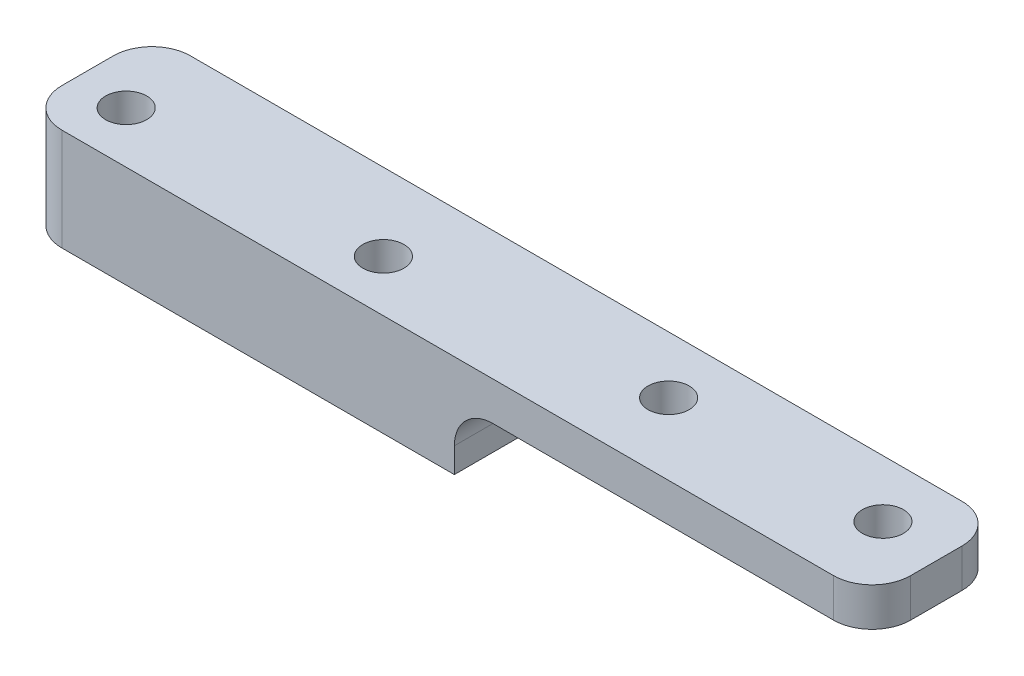
ISO-10303-21;
HEADER;
FILE_DESCRIPTION(('STEP AP214'),'2;1');
FILE_NAME('part.step','',(''),(''),'','','');
FILE_SCHEMA(('AUTOMOTIVE_DESIGN { 1 0 10303 214 1 1 1 1 }'));
ENDSEC;
DATA;
#1=APPLICATION_CONTEXT('core data for automotive mechanical design processes');
#2=APPLICATION_PROTOCOL_DEFINITION('international standard','automotive_design',2000,#1);
#3=PRODUCT_CONTEXT('',#1,'mechanical');
#4=PRODUCT('Part','Part','',(#3));
#5=PRODUCT_RELATED_PRODUCT_CATEGORY('part','',(#4));
#6=PRODUCT_DEFINITION_FORMATION('','',#4);
#7=PRODUCT_DEFINITION_CONTEXT('part definition',#1,'design');
#8=PRODUCT_DEFINITION('design','',#6,#7);
#9=PRODUCT_DEFINITION_SHAPE('','',#8);
#10=(LENGTH_UNIT() NAMED_UNIT(*) SI_UNIT(.MILLI.,.METRE.));
#11=(NAMED_UNIT(*) PLANE_ANGLE_UNIT() SI_UNIT($,.RADIAN.));
#12=(NAMED_UNIT(*) SI_UNIT($,.STERADIAN.) SOLID_ANGLE_UNIT());
#13=UNCERTAINTY_MEASURE_WITH_UNIT(LENGTH_MEASURE(1.E-05),#10,'distance_accuracy_value','');
#14=(GEOMETRIC_REPRESENTATION_CONTEXT(3) GLOBAL_UNCERTAINTY_ASSIGNED_CONTEXT((#13)) GLOBAL_UNIT_ASSIGNED_CONTEXT((#10,
#11,#12)) REPRESENTATION_CONTEXT('',''));
#15=CARTESIAN_POINT('',(0.,0.,0.));
#16=DIRECTION('',(0.,0.,1.));
#17=DIRECTION('',(1.,0.,0.));
#18=AXIS2_PLACEMENT_3D('',#15,#16,#17);
#19=CARTESIAN_POINT('',(0.,0.,0.));
#20=DIRECTION('',(0.,1.,0.));
#21=DIRECTION('',(0.,0.,1.));
#22=AXIS2_PLACEMENT_3D('',#19,#20,#21);
#23=PLANE('',#22);
#24=CARTESIAN_POINT('',(57.2780388615365,0.,-1.563218195589));
#25=DIRECTION('',(0.,1.,0.));
#26=DIRECTION('',(0.,0.,1.));
#27=AXIS2_PLACEMENT_3D('',#24,#25,#26);
#28=CIRCLE('',#27,1.60000000000001);
#29=CARTESIAN_POINT('',(57.2780388615365,0.,0.036781804411004));
#30=VERTEX_POINT('',#29);
#31=EDGE_CURVE('E170',#30,#30,#28,.T.);
#32=ORIENTED_EDGE('',*,*,#31,.T.);
#33=EDGE_LOOP('',(#32));
#34=FACE_BOUND('',#33,.T.);
#35=CARTESIAN_POINT('',(40.6157569894745,0.,-1.56321819558901));
#36=DIRECTION('',(0.,1.,0.));
#37=DIRECTION('',(0.,0.,1.));
#38=AXIS2_PLACEMENT_3D('',#35,#36,#37);
#39=CIRCLE('',#38,1.59999999999999);
#40=CARTESIAN_POINT('',(40.6157569894745,0.,0.0367818044109797));
#41=VERTEX_POINT('',#40);
#42=EDGE_CURVE('E189',#41,#41,#39,.T.);
#43=ORIENTED_EDGE('',*,*,#42,.T.);
#44=EDGE_LOOP('',(#43));
#45=FACE_BOUND('',#44,.T.);
#46=DIRECTION('',(1.,0.,0.));
#47=VECTOR('',#46,1.);
#48=CARTESIAN_POINT('',(-4.,0.,4.));
#49=LINE('',#48,#47);
#50=CARTESIAN_POINT('',(32.5174769490526,0.,4.));
#51=VERTEX_POINT('',#50);
#52=CARTESIAN_POINT('',(59.,0.,4.));
#53=VERTEX_POINT('',#52);
#54=EDGE_CURVE('E208',#51,#53,#49,.T.);
#55=ORIENTED_EDGE('',*,*,#54,.F.);
#56=DIRECTION('',(0.,0.,1.));
#57=VECTOR('',#56,1.);
#58=CARTESIAN_POINT('',(32.5174769490526,0.,-6.));
#59=LINE('',#58,#57);
#60=CARTESIAN_POINT('',(32.5174769490526,0.,-6.));
#61=VERTEX_POINT('',#60);
#62=EDGE_CURVE('E242',#51,#61,#59,.F.);
#63=ORIENTED_EDGE('',*,*,#62,.T.);
#64=DIRECTION('',(-1.,0.,0.));
#65=VECTOR('',#64,1.);
#66=CARTESIAN_POINT('',(-4.,0.,-6.));
#67=LINE('',#66,#65);
#68=CARTESIAN_POINT('',(59.,0.,-6.));
#69=VERTEX_POINT('',#68);
#70=EDGE_CURVE('E214',#69,#61,#67,.T.);
#71=ORIENTED_EDGE('',*,*,#70,.F.);
#72=CARTESIAN_POINT('',(59.,0.,-3.));
#73=DIRECTION('',(0.,1.,0.));
#74=DIRECTION('',(0.,0.,1.));
#75=AXIS2_PLACEMENT_3D('',#72,#73,#74);
#76=CIRCLE('',#75,3.);
#77=CARTESIAN_POINT('',(62.,0.,-3.));
#78=VERTEX_POINT('',#77);
#79=EDGE_CURVE('E236',#69,#78,#76,.F.);
#80=ORIENTED_EDGE('',*,*,#79,.T.);
#81=DIRECTION('',(0.,0.,-1.));
#82=VECTOR('',#81,1.);
#83=CARTESIAN_POINT('',(62.,0.,-6.));
#84=LINE('',#83,#82);
#85=CARTESIAN_POINT('',(62.,0.,1.));
#86=VERTEX_POINT('',#85);
#87=EDGE_CURVE('E228',#86,#78,#84,.T.);
#88=ORIENTED_EDGE('',*,*,#87,.F.);
#89=CARTESIAN_POINT('',(59.,0.,1.));
#90=DIRECTION('',(0.,1.,0.));
#91=DIRECTION('',(0.,0.,1.));
#92=AXIS2_PLACEMENT_3D('',#89,#90,#91);
#93=CIRCLE('',#92,3.);
#94=EDGE_CURVE('E239',#86,#53,#93,.F.);
#95=ORIENTED_EDGE('',*,*,#94,.T.);
#96=EDGE_LOOP('',(#55,#63,#71,#80,#88,#95));
#97=FACE_BOUND('',#96,.T.);
#98=ADVANCED_FACE('F43',(#34,#45,#97),#23,.F.);
#99=CARTESIAN_POINT('',(0.,3.,0.));
#100=DIRECTION('',(0.,1.,0.));
#101=DIRECTION('',(0.,0.,1.));
#102=AXIS2_PLACEMENT_3D('',#99,#100,#101);
#103=PLANE('',#102);
#104=CARTESIAN_POINT('',(40.6157569894745,3.,-1.56321819558901));
#105=DIRECTION('',(0.,1.,0.));
#106=DIRECTION('',(0.,0.,1.));
#107=AXIS2_PLACEMENT_3D('',#104,#105,#106);
#108=CIRCLE('',#107,1.59999999999999);
#109=CARTESIAN_POINT('',(40.6157569894745,3.,0.0367818044109797));
#110=VERTEX_POINT('',#109);
#111=EDGE_CURVE('E193',#110,#110,#108,.T.);
#112=ORIENTED_EDGE('',*,*,#111,.F.);
#113=EDGE_LOOP('',(#112));
#114=FACE_BOUND('',#113,.T.);
#115=CARTESIAN_POINT('',(0.,3.,0.));
#116=DIRECTION('',(0.,1.,0.));
#117=DIRECTION('',(0.,0.,1.));
#118=AXIS2_PLACEMENT_3D('',#115,#116,#117);
#119=CIRCLE('',#118,1.59999999999999);
#120=CARTESIAN_POINT('',(0.,3.,1.59999999999999));
#121=VERTEX_POINT('',#120);
#122=EDGE_CURVE('E204',#121,#121,#119,.T.);
#123=ORIENTED_EDGE('',*,*,#122,.F.);
#124=EDGE_LOOP('',(#123));
#125=FACE_BOUND('',#124,.T.);
#126=DIRECTION('',(0.,0.,1.));
#127=VECTOR('',#126,1.);
#128=CARTESIAN_POINT('',(-4.,3.,-6.));
#129=LINE('',#128,#127);
#130=CARTESIAN_POINT('',(-4.,3.,-3.));
#131=VERTEX_POINT('',#130);
#132=CARTESIAN_POINT('',(-4.,3.,1.));
#133=VERTEX_POINT('',#132);
#134=EDGE_CURVE('E209',#131,#133,#129,.T.);
#135=ORIENTED_EDGE('',*,*,#134,.T.);
#136=CARTESIAN_POINT('',(-1.,3.,1.));
#137=DIRECTION('',(0.,1.,0.));
#138=DIRECTION('',(0.,0.,1.));
#139=AXIS2_PLACEMENT_3D('',#136,#137,#138);
#140=CIRCLE('',#139,3.);
#141=CARTESIAN_POINT('',(-1.,3.,4.));
#142=VERTEX_POINT('',#141);
#143=EDGE_CURVE('E272',#133,#142,#140,.T.);
#144=ORIENTED_EDGE('',*,*,#143,.T.);
#145=DIRECTION('',(1.,0.,0.));
#146=VECTOR('',#145,1.);
#147=CARTESIAN_POINT('',(-4.,3.,4.));
#148=LINE('',#147,#146);
#149=CARTESIAN_POINT('',(59.,3.,4.));
#150=VERTEX_POINT('',#149);
#151=EDGE_CURVE('E213',#142,#150,#148,.T.);
#152=ORIENTED_EDGE('',*,*,#151,.T.);
#153=CARTESIAN_POINT('',(59.,3.,1.));
#154=DIRECTION('',(0.,1.,0.));
#155=DIRECTION('',(0.,0.,1.));
#156=AXIS2_PLACEMENT_3D('',#153,#154,#155);
#157=CIRCLE('',#156,3.);
#158=CARTESIAN_POINT('',(62.,3.,1.));
#159=VERTEX_POINT('',#158);
#160=EDGE_CURVE('E266',#150,#159,#157,.T.);
#161=ORIENTED_EDGE('',*,*,#160,.T.);
#162=DIRECTION('',(0.,0.,-1.));
#163=VECTOR('',#162,1.);
#164=CARTESIAN_POINT('',(62.,3.,-6.));
#165=LINE('',#164,#163);
#166=CARTESIAN_POINT('',(62.,3.,-3.));
#167=VERTEX_POINT('',#166);
#168=EDGE_CURVE('E218',#159,#167,#165,.T.);
#169=ORIENTED_EDGE('',*,*,#168,.T.);
#170=CARTESIAN_POINT('',(59.,3.,-3.));
#171=DIRECTION('',(0.,1.,0.));
#172=DIRECTION('',(0.,0.,1.));
#173=AXIS2_PLACEMENT_3D('',#170,#171,#172);
#174=CIRCLE('',#173,3.);
#175=CARTESIAN_POINT('',(59.,3.,-6.));
#176=VERTEX_POINT('',#175);
#177=EDGE_CURVE('E72',#167,#176,#174,.T.);
#178=ORIENTED_EDGE('',*,*,#177,.T.);
#179=DIRECTION('',(-1.,0.,0.));
#180=VECTOR('',#179,1.);
#181=CARTESIAN_POINT('',(-4.,3.,-6.));
#182=LINE('',#181,#180);
#183=CARTESIAN_POINT('',(-1.,3.,-6.));
#184=VERTEX_POINT('',#183);
#185=EDGE_CURVE('E221',#176,#184,#182,.T.);
#186=ORIENTED_EDGE('',*,*,#185,.T.);
#187=CARTESIAN_POINT('',(-1.,3.,-3.));
#188=DIRECTION('',(0.,1.,0.));
#189=DIRECTION('',(0.,0.,1.));
#190=AXIS2_PLACEMENT_3D('',#187,#188,#189);
#191=CIRCLE('',#190,3.);
#192=EDGE_CURVE('E269',#184,#131,#191,.T.);
#193=ORIENTED_EDGE('',*,*,#192,.T.);
#194=EDGE_LOOP('',(#135,#144,#152,#161,#169,#178,#186,#193));
#195=FACE_BOUND('',#194,.T.);
#196=CARTESIAN_POINT('',(20.,3.,0.));
#197=DIRECTION('',(0.,1.,0.));
#198=DIRECTION('',(0.,0.,1.));
#199=AXIS2_PLACEMENT_3D('',#196,#197,#198);
#200=CIRCLE('',#199,1.60000000000001);
#201=CARTESIAN_POINT('',(20.,3.,1.60000000000001));
#202=VERTEX_POINT('',#201);
#203=EDGE_CURVE('E197',#202,#202,#200,.T.);
#204=ORIENTED_EDGE('',*,*,#203,.F.);
#205=EDGE_LOOP('',(#204));
#206=FACE_BOUND('',#205,.T.);
#207=CARTESIAN_POINT('',(57.2780388615365,3.,-1.563218195589));
#208=DIRECTION('',(0.,1.,0.));
#209=DIRECTION('',(0.,0.,1.));
#210=AXIS2_PLACEMENT_3D('',#207,#208,#209);
#211=CIRCLE('',#210,1.60000000000001);
#212=CARTESIAN_POINT('',(57.2780388615365,3.,0.036781804411004));
#213=VERTEX_POINT('',#212);
#214=EDGE_CURVE('E185',#213,#213,#211,.T.);
#215=ORIENTED_EDGE('',*,*,#214,.F.);
#216=EDGE_LOOP('',(#215));
#217=FACE_BOUND('',#216,.T.);
#218=ADVANCED_FACE('F312',(#114,#125,#195,#206,#217),#103,.T.);
#219=CARTESIAN_POINT('',(-4.,3.,-6.));
#220=DIRECTION('',(1.,0.,0.));
#221=DIRECTION('',(0.,0.,-1.));
#222=AXIS2_PLACEMENT_3D('',#219,#220,#221);
#223=PLANE('',#222);
#224=DIRECTION('',(0.,0.,-1.));
#225=VECTOR('',#224,1.);
#226=CARTESIAN_POINT('',(-4.,-4.94,4.));
#227=LINE('',#226,#225);
#228=CARTESIAN_POINT('',(-4.,-4.94,1.));
#229=VERTEX_POINT('',#228);
#230=CARTESIAN_POINT('',(-4.,-4.94,-3.));
#231=VERTEX_POINT('',#230);
#232=EDGE_CURVE('E159',#229,#231,#227,.T.);
#233=ORIENTED_EDGE('',*,*,#232,.F.);
#234=DIRECTION('',(0.,-1.,0.));
#235=VECTOR('',#234,1.);
#236=CARTESIAN_POINT('',(-4.,3.,1.));
#237=LINE('',#236,#235);
#238=EDGE_CURVE('E261',#229,#133,#237,.F.);
#239=ORIENTED_EDGE('',*,*,#238,.T.);
#240=ORIENTED_EDGE('',*,*,#134,.F.);
#241=DIRECTION('',(0.,-1.,0.));
#242=VECTOR('',#241,1.);
#243=CARTESIAN_POINT('',(-4.,3.,-3.));
#244=LINE('',#243,#242);
#245=EDGE_CURVE('E257',#131,#231,#244,.T.);
#246=ORIENTED_EDGE('',*,*,#245,.T.);
#247=EDGE_LOOP('',(#233,#239,#240,#246));
#248=FACE_BOUND('',#247,.T.);
#249=ADVANCED_FACE('F318',(#248),#223,.F.);
#250=CARTESIAN_POINT('',(-4.,3.,4.));
#251=DIRECTION('',(0.,0.,-1.));
#252=DIRECTION('',(-1.,0.,0.));
#253=AXIS2_PLACEMENT_3D('',#250,#251,#252);
#254=PLANE('',#253);
#255=ORIENTED_EDGE('',*,*,#151,.F.);
#256=DIRECTION('',(0.,-1.,0.));
#257=VECTOR('',#256,1.);
#258=CARTESIAN_POINT('',(-1.,3.,4.));
#259=LINE('',#258,#257);
#260=CARTESIAN_POINT('',(-1.,-4.94,4.));
#261=VERTEX_POINT('',#260);
#262=EDGE_CURVE('E248',#142,#261,#259,.T.);
#263=ORIENTED_EDGE('',*,*,#262,.T.);
#264=DIRECTION('',(-1.,0.,0.));
#265=VECTOR('',#264,1.);
#266=CARTESIAN_POINT('',(-4.,-4.94,4.));
#267=LINE('',#266,#265);
#268=CARTESIAN_POINT('',(29.5174769490526,-4.94,4.));
#269=VERTEX_POINT('',#268);
#270=EDGE_CURVE('E177',#269,#261,#267,.T.);
#271=ORIENTED_EDGE('',*,*,#270,.F.);
#272=DIRECTION('',(0.,1.,0.));
#273=VECTOR('',#272,1.);
#274=CARTESIAN_POINT('',(29.5174769490526,-4.94,4.));
#275=LINE('',#274,#273);
#276=CARTESIAN_POINT('',(29.5174769490526,-3.,4.));
#277=VERTEX_POINT('',#276);
#278=EDGE_CURVE('E171',#269,#277,#275,.T.);
#279=ORIENTED_EDGE('',*,*,#278,.T.);
#280=CARTESIAN_POINT('',(32.5174769490526,-3.,4.));
#281=DIRECTION('',(0.,0.,-1.));
#282=DIRECTION('',(-1.,0.,0.));
#283=AXIS2_PLACEMENT_3D('',#280,#281,#282);
#284=CIRCLE('',#283,3.);
#285=EDGE_CURVE('E52',#277,#51,#284,.T.);
#286=ORIENTED_EDGE('',*,*,#285,.T.);
#287=ORIENTED_EDGE('',*,*,#54,.T.);
#288=DIRECTION('',(0.,-1.,0.));
#289=VECTOR('',#288,1.);
#290=CARTESIAN_POINT('',(59.,3.,4.));
#291=LINE('',#290,#289);
#292=EDGE_CURVE('E245',#53,#150,#291,.F.);
#293=ORIENTED_EDGE('',*,*,#292,.T.);
#294=EDGE_LOOP('',(#255,#263,#271,#279,#286,#287,#293));
#295=FACE_BOUND('',#294,.T.);
#296=ADVANCED_FACE('F291',(#295),#254,.F.);
#297=CARTESIAN_POINT('',(62.,3.,-6.));
#298=DIRECTION('',(-1.,0.,0.));
#299=DIRECTION('',(0.,0.,1.));
#300=AXIS2_PLACEMENT_3D('',#297,#298,#299);
#301=PLANE('',#300);
#302=ORIENTED_EDGE('',*,*,#168,.F.);
#303=DIRECTION('',(0.,-1.,0.));
#304=VECTOR('',#303,1.);
#305=CARTESIAN_POINT('',(62.,3.,1.));
#306=LINE('',#305,#304);
#307=EDGE_CURVE('E284',#159,#86,#306,.T.);
#308=ORIENTED_EDGE('',*,*,#307,.T.);
#309=ORIENTED_EDGE('',*,*,#87,.T.);
#310=DIRECTION('',(0.,-1.,0.));
#311=VECTOR('',#310,1.);
#312=CARTESIAN_POINT('',(62.,3.,-3.));
#313=LINE('',#312,#311);
#314=EDGE_CURVE('E281',#78,#167,#313,.F.);
#315=ORIENTED_EDGE('',*,*,#314,.T.);
#316=EDGE_LOOP('',(#302,#308,#309,#315));
#317=FACE_BOUND('',#316,.T.);
#318=ADVANCED_FACE('F327',(#317),#301,.F.);
#319=CARTESIAN_POINT('',(-4.,3.,-6.));
#320=DIRECTION('',(0.,0.,1.));
#321=DIRECTION('',(1.,0.,0.));
#322=AXIS2_PLACEMENT_3D('',#319,#320,#321);
#323=PLANE('',#322);
#324=DIRECTION('',(1.,0.,0.));
#325=VECTOR('',#324,1.);
#326=CARTESIAN_POINT('',(-4.,-4.94,-6.));
#327=LINE('',#326,#325);
#328=CARTESIAN_POINT('',(-1.,-4.94,-6.));
#329=VERTEX_POINT('',#328);
#330=CARTESIAN_POINT('',(29.5174769490526,-4.94,-6.));
#331=VERTEX_POINT('',#330);
#332=EDGE_CURVE('E148',#329,#331,#327,.T.);
#333=ORIENTED_EDGE('',*,*,#332,.F.);
#334=DIRECTION('',(0.,-1.,0.));
#335=VECTOR('',#334,1.);
#336=CARTESIAN_POINT('',(-1.,3.,-6.));
#337=LINE('',#336,#335);
#338=EDGE_CURVE('E62',#329,#184,#337,.F.);
#339=ORIENTED_EDGE('',*,*,#338,.T.);
#340=ORIENTED_EDGE('',*,*,#185,.F.);
#341=DIRECTION('',(0.,-1.,0.));
#342=VECTOR('',#341,1.);
#343=CARTESIAN_POINT('',(59.,3.,-6.));
#344=LINE('',#343,#342);
#345=EDGE_CURVE('E275',#176,#69,#344,.T.);
#346=ORIENTED_EDGE('',*,*,#345,.T.);
#347=ORIENTED_EDGE('',*,*,#70,.T.);
#348=CARTESIAN_POINT('',(32.5174769490526,-3.,-6.));
#349=DIRECTION('',(0.,0.,1.));
#350=DIRECTION('',(1.,0.,0.));
#351=AXIS2_PLACEMENT_3D('',#348,#349,#350);
#352=CIRCLE('',#351,3.);
#353=CARTESIAN_POINT('',(29.5174769490526,-3.,-6.));
#354=VERTEX_POINT('',#353);
#355=EDGE_CURVE('E11',#61,#354,#352,.T.);
#356=ORIENTED_EDGE('',*,*,#355,.T.);
#357=DIRECTION('',(0.,1.,0.));
#358=VECTOR('',#357,1.);
#359=CARTESIAN_POINT('',(29.5174769490526,-4.94,-6.));
#360=LINE('',#359,#358);
#361=EDGE_CURVE('E162',#331,#354,#360,.T.);
#362=ORIENTED_EDGE('',*,*,#361,.F.);
#363=EDGE_LOOP('',(#333,#339,#340,#346,#347,#356,#362));
#364=FACE_BOUND('',#363,.T.);
#365=ADVANCED_FACE('F163',(#364),#323,.F.);
#366=CARTESIAN_POINT('',(0.,3.,0.));
#367=DIRECTION('',(0.,-1.,0.));
#368=DIRECTION('',(0.,0.,-1.));
#369=AXIS2_PLACEMENT_3D('',#366,#367,#368);
#370=CYLINDRICAL_SURFACE('',#369,1.59999999999999);
#371=ORIENTED_EDGE('',*,*,#122,.T.);
#372=EDGE_LOOP('',(#371));
#373=FACE_BOUND('',#372,.T.);
#374=CARTESIAN_POINT('',(0.,-4.94,0.));
#375=DIRECTION('',(0.,-1.,0.));
#376=DIRECTION('',(0.,0.,-1.));
#377=AXIS2_PLACEMENT_3D('',#374,#375,#376);
#378=CIRCLE('',#377,1.59999999999999);
#379=CARTESIAN_POINT('',(0.,-4.94,-1.59999999999999));
#380=VERTEX_POINT('',#379);
#381=EDGE_CURVE('E341',#380,#380,#378,.T.);
#382=ORIENTED_EDGE('',*,*,#381,.T.);
#383=EDGE_LOOP('',(#382));
#384=FACE_BOUND('',#383,.T.);
#385=ADVANCED_FACE('F326',(#373,#384),#370,.F.);
#386=CARTESIAN_POINT('',(20.,3.,0.));
#387=DIRECTION('',(0.,-1.,0.));
#388=DIRECTION('',(0.,0.,-1.));
#389=AXIS2_PLACEMENT_3D('',#386,#387,#388);
#390=CYLINDRICAL_SURFACE('',#389,1.60000000000001);
#391=ORIENTED_EDGE('',*,*,#203,.T.);
#392=EDGE_LOOP('',(#391));
#393=FACE_BOUND('',#392,.T.);
#394=CARTESIAN_POINT('',(20.,-4.94,0.));
#395=DIRECTION('',(0.,-1.,0.));
#396=DIRECTION('',(0.,0.,-1.));
#397=AXIS2_PLACEMENT_3D('',#394,#395,#396);
#398=CIRCLE('',#397,1.60000000000001);
#399=CARTESIAN_POINT('',(20.,-4.94,-1.60000000000001));
#400=VERTEX_POINT('',#399);
#401=EDGE_CURVE('E491',#400,#400,#398,.T.);
#402=ORIENTED_EDGE('',*,*,#401,.T.);
#403=EDGE_LOOP('',(#402));
#404=FACE_BOUND('',#403,.T.);
#405=ADVANCED_FACE('F378',(#393,#404),#390,.F.);
#406=CARTESIAN_POINT('',(40.6157569894745,3.,-1.56321819558901));
#407=DIRECTION('',(0.,-1.,0.));
#408=DIRECTION('',(0.,0.,-1.));
#409=AXIS2_PLACEMENT_3D('',#406,#407,#408);
#410=CYLINDRICAL_SURFACE('',#409,1.59999999999999);
#411=ORIENTED_EDGE('',*,*,#111,.T.);
#412=EDGE_LOOP('',(#411));
#413=FACE_BOUND('',#412,.T.);
#414=ORIENTED_EDGE('',*,*,#42,.F.);
#415=EDGE_LOOP('',(#414));
#416=FACE_BOUND('',#415,.T.);
#417=ADVANCED_FACE('F381',(#413,#416),#410,.F.);
#418=CARTESIAN_POINT('',(57.2780388615365,3.,-1.563218195589));
#419=DIRECTION('',(0.,-1.,0.));
#420=DIRECTION('',(0.,0.,-1.));
#421=AXIS2_PLACEMENT_3D('',#418,#419,#420);
#422=CYLINDRICAL_SURFACE('',#421,1.60000000000001);
#423=ORIENTED_EDGE('',*,*,#214,.T.);
#424=EDGE_LOOP('',(#423));
#425=FACE_BOUND('',#424,.T.);
#426=ORIENTED_EDGE('',*,*,#31,.F.);
#427=EDGE_LOOP('',(#426));
#428=FACE_BOUND('',#427,.T.);
#429=ADVANCED_FACE('F370',(#425,#428),#422,.F.);
#430=CARTESIAN_POINT('',(0.,-4.94,0.));
#431=DIRECTION('',(0.,-1.,0.));
#432=DIRECTION('',(0.,0.,-1.));
#433=AXIS2_PLACEMENT_3D('',#430,#431,#432);
#434=PLANE('',#433);
#435=ORIENTED_EDGE('',*,*,#381,.F.);
#436=EDGE_LOOP('',(#435));
#437=FACE_BOUND('',#436,.T.);
#438=ORIENTED_EDGE('',*,*,#270,.T.);
#439=CARTESIAN_POINT('',(-1.,-4.94,1.));
#440=DIRECTION('',(0.,-1.,0.));
#441=DIRECTION('',(0.,0.,-1.));
#442=AXIS2_PLACEMENT_3D('',#439,#440,#441);
#443=CIRCLE('',#442,3.);
#444=EDGE_CURVE('E254',#261,#229,#443,.T.);
#445=ORIENTED_EDGE('',*,*,#444,.T.);
#446=ORIENTED_EDGE('',*,*,#232,.T.);
#447=CARTESIAN_POINT('',(-1.,-4.94,-3.));
#448=DIRECTION('',(0.,-1.,0.));
#449=DIRECTION('',(0.,0.,-1.));
#450=AXIS2_PLACEMENT_3D('',#447,#448,#449);
#451=CIRCLE('',#450,3.);
#452=EDGE_CURVE('E157',#231,#329,#451,.T.);
#453=ORIENTED_EDGE('',*,*,#452,.T.);
#454=ORIENTED_EDGE('',*,*,#332,.T.);
#455=DIRECTION('',(0.,0.,1.));
#456=VECTOR('',#455,1.);
#457=CARTESIAN_POINT('',(29.5174769490526,-4.94,4.));
#458=LINE('',#457,#456);
#459=EDGE_CURVE('E154',#331,#269,#458,.T.);
#460=ORIENTED_EDGE('',*,*,#459,.T.);
#461=EDGE_LOOP('',(#438,#445,#446,#453,#454,#460));
#462=FACE_BOUND('',#461,.T.);
#463=ORIENTED_EDGE('',*,*,#401,.F.);
#464=EDGE_LOOP('',(#463));
#465=FACE_BOUND('',#464,.T.);
#466=ADVANCED_FACE('F151',(#437,#462,#465),#434,.T.);
#467=CARTESIAN_POINT('',(29.5174769490526,-4.94,4.));
#468=DIRECTION('',(-1.,0.,0.));
#469=DIRECTION('',(0.,0.,1.));
#470=AXIS2_PLACEMENT_3D('',#467,#468,#469);
#471=PLANE('',#470);
#472=ORIENTED_EDGE('',*,*,#361,.T.);
#473=DIRECTION('',(0.,0.,1.));
#474=VECTOR('',#473,1.);
#475=CARTESIAN_POINT('',(29.5174769490526,-3.,4.));
#476=LINE('',#475,#474);
#477=EDGE_CURVE('E224',#354,#277,#476,.T.);
#478=ORIENTED_EDGE('',*,*,#477,.T.);
#479=ORIENTED_EDGE('',*,*,#278,.F.);
#480=ORIENTED_EDGE('',*,*,#459,.F.);
#481=EDGE_LOOP('',(#472,#478,#479,#480));
#482=FACE_BOUND('',#481,.T.);
#483=ADVANCED_FACE('F173',(#482),#471,.F.);
#484=CARTESIAN_POINT('',(32.5174769490526,-3.,4.));
#485=DIRECTION('',(0.,0.,-1.));
#486=DIRECTION('',(-1.,0.,0.));
#487=AXIS2_PLACEMENT_3D('',#484,#485,#486);
#488=CYLINDRICAL_SURFACE('',#487,3.);
#489=ORIENTED_EDGE('',*,*,#355,.F.);
#490=ORIENTED_EDGE('',*,*,#62,.F.);
#491=ORIENTED_EDGE('',*,*,#285,.F.);
#492=ORIENTED_EDGE('',*,*,#477,.F.);
#493=EDGE_LOOP('',(#489,#490,#491,#492));
#494=FACE_BOUND('',#493,.T.);
#495=ADVANCED_FACE('F298',(#494),#488,.F.);
#496=CARTESIAN_POINT('',(-1.,3.,1.));
#497=DIRECTION('',(0.,-1.,0.));
#498=DIRECTION('',(0.,0.,-1.));
#499=AXIS2_PLACEMENT_3D('',#496,#497,#498);
#500=CYLINDRICAL_SURFACE('',#499,3.);
#501=ORIENTED_EDGE('',*,*,#143,.F.);
#502=ORIENTED_EDGE('',*,*,#238,.F.);
#503=ORIENTED_EDGE('',*,*,#444,.F.);
#504=ORIENTED_EDGE('',*,*,#262,.F.);
#505=EDGE_LOOP('',(#501,#502,#503,#504));
#506=FACE_BOUND('',#505,.T.);
#507=ADVANCED_FACE('F300',(#506),#500,.T.);
#508=CARTESIAN_POINT('',(-1.,3.,-3.));
#509=DIRECTION('',(0.,-1.,0.));
#510=DIRECTION('',(0.,0.,-1.));
#511=AXIS2_PLACEMENT_3D('',#508,#509,#510);
#512=CYLINDRICAL_SURFACE('',#511,3.);
#513=ORIENTED_EDGE('',*,*,#192,.F.);
#514=ORIENTED_EDGE('',*,*,#338,.F.);
#515=ORIENTED_EDGE('',*,*,#452,.F.);
#516=ORIENTED_EDGE('',*,*,#245,.F.);
#517=EDGE_LOOP('',(#513,#514,#515,#516));
#518=FACE_BOUND('',#517,.T.);
#519=ADVANCED_FACE('F306',(#518),#512,.T.);
#520=CARTESIAN_POINT('',(59.,3.,1.));
#521=DIRECTION('',(0.,-1.,0.));
#522=DIRECTION('',(0.,0.,-1.));
#523=AXIS2_PLACEMENT_3D('',#520,#521,#522);
#524=CYLINDRICAL_SURFACE('',#523,3.);
#525=ORIENTED_EDGE('',*,*,#160,.F.);
#526=ORIENTED_EDGE('',*,*,#292,.F.);
#527=ORIENTED_EDGE('',*,*,#94,.F.);
#528=ORIENTED_EDGE('',*,*,#307,.F.);
#529=EDGE_LOOP('',(#525,#526,#527,#528));
#530=FACE_BOUND('',#529,.T.);
#531=ADVANCED_FACE('F347',(#530),#524,.T.);
#532=CARTESIAN_POINT('',(59.,3.,-3.));
#533=DIRECTION('',(0.,-1.,0.));
#534=DIRECTION('',(0.,0.,-1.));
#535=AXIS2_PLACEMENT_3D('',#532,#533,#534);
#536=CYLINDRICAL_SURFACE('',#535,3.);
#537=ORIENTED_EDGE('',*,*,#177,.F.);
#538=ORIENTED_EDGE('',*,*,#314,.F.);
#539=ORIENTED_EDGE('',*,*,#79,.F.);
#540=ORIENTED_EDGE('',*,*,#345,.F.);
#541=EDGE_LOOP('',(#537,#538,#539,#540));
#542=FACE_BOUND('',#541,.T.);
#543=ADVANCED_FACE('F45',(#542),#536,.T.);
#544=CLOSED_SHELL('',(#98,#218,#249,#296,#318,#365,#385,#405,#417,#429,#466,#483,#495,#507,#519,
#531,#543));
#545=MANIFOLD_SOLID_BREP('B2',#544);
#546=ADVANCED_BREP_SHAPE_REPRESENTATION('',(#18,#545),#14);
#547=SHAPE_DEFINITION_REPRESENTATION(#9,#546);
ENDSEC;
END-ISO-10303-21;
